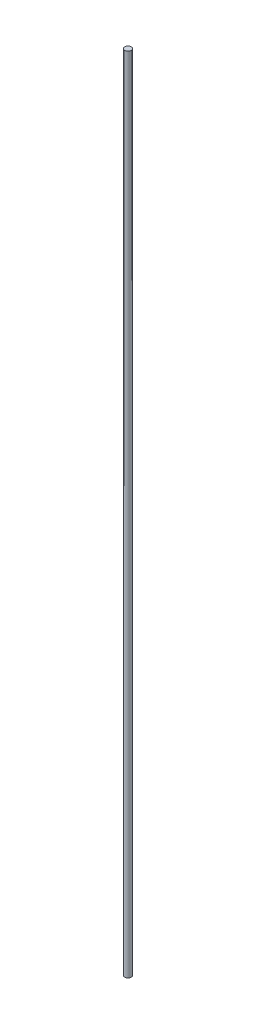
ISO-10303-21;
HEADER;
FILE_DESCRIPTION(('STEP AP214'),'2;1');
FILE_NAME('part.step','',(''),(''),'','','');
FILE_SCHEMA(('AUTOMOTIVE_DESIGN { 1 0 10303 214 1 1 1 1 }'));
ENDSEC;
DATA;
#1=APPLICATION_CONTEXT('core data for automotive mechanical design processes');
#2=APPLICATION_PROTOCOL_DEFINITION('international standard','automotive_design',2000,#1);
#3=PRODUCT_CONTEXT('',#1,'mechanical');
#4=PRODUCT('Part','Part','',(#3));
#5=PRODUCT_RELATED_PRODUCT_CATEGORY('part','',(#4));
#6=PRODUCT_DEFINITION_FORMATION('','',#4);
#7=PRODUCT_DEFINITION_CONTEXT('part definition',#1,'design');
#8=PRODUCT_DEFINITION('design','',#6,#7);
#9=PRODUCT_DEFINITION_SHAPE('','',#8);
#10=(LENGTH_UNIT() NAMED_UNIT(*) SI_UNIT(.MILLI.,.METRE.));
#11=(NAMED_UNIT(*) PLANE_ANGLE_UNIT() SI_UNIT($,.RADIAN.));
#12=(NAMED_UNIT(*) SI_UNIT($,.STERADIAN.) SOLID_ANGLE_UNIT());
#13=UNCERTAINTY_MEASURE_WITH_UNIT(LENGTH_MEASURE(1.E-05),#10,'distance_accuracy_value','');
#14=(GEOMETRIC_REPRESENTATION_CONTEXT(3) GLOBAL_UNCERTAINTY_ASSIGNED_CONTEXT((#13)) GLOBAL_UNIT_ASSIGNED_CONTEXT((#10,
#11,#12)) REPRESENTATION_CONTEXT('',''));
#15=CARTESIAN_POINT('',(0.,0.,0.));
#16=DIRECTION('',(0.,0.,1.));
#17=DIRECTION('',(1.,0.,0.));
#18=AXIS2_PLACEMENT_3D('',#15,#16,#17);
#19=CARTESIAN_POINT('',(0.,1000.,0.));
#20=DIRECTION('',(0.,-1.,0.));
#21=DIRECTION('',(0.,0.,-1.));
#22=AXIS2_PLACEMENT_3D('',#19,#20,#21);
#23=CYLINDRICAL_SURFACE('',#22,4.);
#24=CARTESIAN_POINT('',(0.,1000.,0.));
#25=DIRECTION('',(0.,1.,0.));
#26=DIRECTION('',(0.,0.,1.));
#27=AXIS2_PLACEMENT_3D('',#24,#25,#26);
#28=CIRCLE('',#27,4.);
#29=CARTESIAN_POINT('',(0.,1000.,4.));
#30=VERTEX_POINT('',#29);
#31=EDGE_CURVE('E10',#30,#30,#28,.T.);
#32=ORIENTED_EDGE('',*,*,#31,.F.);
#33=EDGE_LOOP('',(#32));
#34=FACE_BOUND('',#33,.T.);
#35=CARTESIAN_POINT('',(0.,0.,0.));
#36=DIRECTION('',(0.,1.,0.));
#37=DIRECTION('',(0.,0.,1.));
#38=AXIS2_PLACEMENT_3D('',#35,#36,#37);
#39=CIRCLE('',#38,4.);
#40=CARTESIAN_POINT('',(0.,0.,4.));
#41=VERTEX_POINT('',#40);
#42=EDGE_CURVE('E38',#41,#41,#39,.T.);
#43=ORIENTED_EDGE('',*,*,#42,.T.);
#44=EDGE_LOOP('',(#43));
#45=FACE_BOUND('',#44,.T.);
#46=ADVANCED_FACE('F35',(#34,#45),#23,.T.);
#47=CARTESIAN_POINT('',(0.,1000.,0.));
#48=DIRECTION('',(0.,1.,0.));
#49=DIRECTION('',(0.,0.,1.));
#50=AXIS2_PLACEMENT_3D('',#47,#48,#49);
#51=PLANE('',#50);
#52=ORIENTED_EDGE('',*,*,#31,.T.);
#53=EDGE_LOOP('',(#52));
#54=FACE_BOUND('',#53,.T.);
#55=ADVANCED_FACE('F50',(#54),#51,.T.);
#56=CARTESIAN_POINT('',(0.,0.,0.));
#57=DIRECTION('',(0.,1.,0.));
#58=DIRECTION('',(0.,0.,1.));
#59=AXIS2_PLACEMENT_3D('',#56,#57,#58);
#60=PLANE('',#59);
#61=ORIENTED_EDGE('',*,*,#42,.F.);
#62=EDGE_LOOP('',(#61));
#63=FACE_BOUND('',#62,.T.);
#64=ADVANCED_FACE('F48',(#63),#60,.F.);
#65=CLOSED_SHELL('',(#46,#55,#64));
#66=MANIFOLD_SOLID_BREP('B2',#65);
#67=ADVANCED_BREP_SHAPE_REPRESENTATION('',(#18,#66),#14);
#68=SHAPE_DEFINITION_REPRESENTATION(#9,#67);
ENDSEC;
END-ISO-10303-21;
